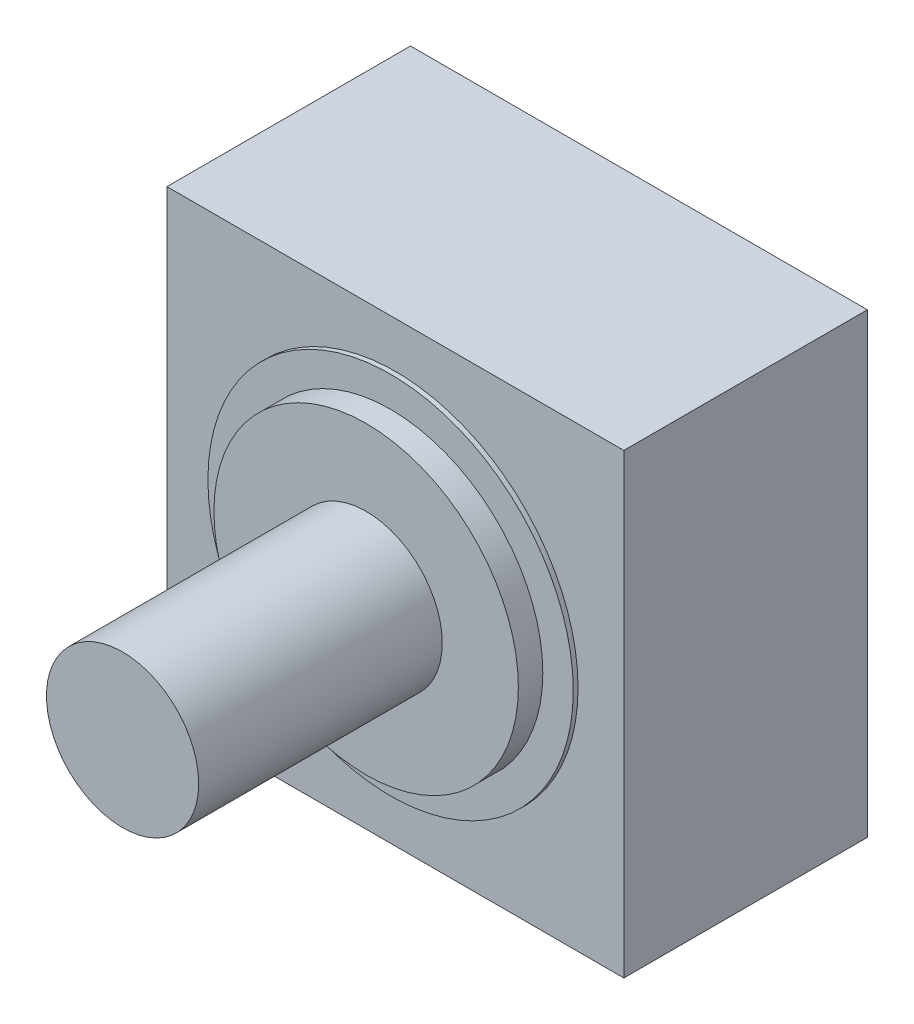
ISO-10303-21;
HEADER;
FILE_DESCRIPTION(('STEP AP214'),'2;1');
FILE_NAME('part.step','',(''),(''),'','','');
FILE_SCHEMA(('AUTOMOTIVE_DESIGN { 1 0 10303 214 1 1 1 1 }'));
ENDSEC;
DATA;
#1=APPLICATION_CONTEXT('core data for automotive mechanical design processes');
#2=APPLICATION_PROTOCOL_DEFINITION('international standard','automotive_design',2000,#1);
#3=PRODUCT_CONTEXT('',#1,'mechanical');
#4=PRODUCT('Part','Part','',(#3));
#5=PRODUCT_RELATED_PRODUCT_CATEGORY('part','',(#4));
#6=PRODUCT_DEFINITION_FORMATION('','',#4);
#7=PRODUCT_DEFINITION_CONTEXT('part definition',#1,'design');
#8=PRODUCT_DEFINITION('design','',#6,#7);
#9=PRODUCT_DEFINITION_SHAPE('','',#8);
#10=(LENGTH_UNIT() NAMED_UNIT(*) SI_UNIT(.MILLI.,.METRE.));
#11=(NAMED_UNIT(*) PLANE_ANGLE_UNIT() SI_UNIT($,.RADIAN.));
#12=(NAMED_UNIT(*) SI_UNIT($,.STERADIAN.) SOLID_ANGLE_UNIT());
#13=UNCERTAINTY_MEASURE_WITH_UNIT(LENGTH_MEASURE(1.E-05),#10,'distance_accuracy_value','');
#14=(GEOMETRIC_REPRESENTATION_CONTEXT(3) GLOBAL_UNCERTAINTY_ASSIGNED_CONTEXT((#13)) GLOBAL_UNIT_ASSIGNED_CONTEXT((#10,
#11,#12)) REPRESENTATION_CONTEXT('',''));
#15=CARTESIAN_POINT('',(0.,0.,0.));
#16=DIRECTION('',(0.,0.,1.));
#17=DIRECTION('',(1.,0.,0.));
#18=AXIS2_PLACEMENT_3D('',#15,#16,#17);
#19=CARTESIAN_POINT('',(0.,0.,5.08));
#20=DIRECTION('',(1.,0.,0.));
#21=DIRECTION('',(0.,0.,-1.));
#22=AXIS2_PLACEMENT_3D('',#19,#20,#21);
#23=PLANE('',#22);
#24=DIRECTION('',(0.,-1.,0.));
#25=VECTOR('',#24,1.);
#26=CARTESIAN_POINT('',(0.,0.,0.));
#27=LINE('',#26,#25);
#28=CARTESIAN_POINT('',(0.,9.53,0.));
#29=VERTEX_POINT('',#28);
#30=CARTESIAN_POINT('',(0.,0.,0.));
#31=VERTEX_POINT('',#30);
#32=EDGE_CURVE('E101',#29,#31,#27,.T.);
#33=ORIENTED_EDGE('',*,*,#32,.T.);
#34=DIRECTION('',(0.,0.,-1.));
#35=VECTOR('',#34,1.);
#36=CARTESIAN_POINT('',(0.,0.,5.08));
#37=LINE('',#36,#35);
#38=CARTESIAN_POINT('',(0.,0.,5.08));
#39=VERTEX_POINT('',#38);
#40=EDGE_CURVE('E43',#39,#31,#37,.T.);
#41=ORIENTED_EDGE('',*,*,#40,.F.);
#42=DIRECTION('',(0.,-1.,0.));
#43=VECTOR('',#42,1.);
#44=CARTESIAN_POINT('',(0.,0.,5.08));
#45=LINE('',#44,#43);
#46=CARTESIAN_POINT('',(0.,9.53,5.08));
#47=VERTEX_POINT('',#46);
#48=EDGE_CURVE('E87',#47,#39,#45,.T.);
#49=ORIENTED_EDGE('',*,*,#48,.F.);
#50=DIRECTION('',(0.,0.,-1.));
#51=VECTOR('',#50,1.);
#52=CARTESIAN_POINT('',(0.,9.53,5.08));
#53=LINE('',#52,#51);
#54=EDGE_CURVE('E97',#47,#29,#53,.T.);
#55=ORIENTED_EDGE('',*,*,#54,.T.);
#56=EDGE_LOOP('',(#33,#41,#49,#55));
#57=FACE_BOUND('',#56,.T.);
#58=ADVANCED_FACE('F35',(#57),#23,.F.);
#59=CARTESIAN_POINT('',(0.,0.,5.08));
#60=DIRECTION('',(0.,1.,0.));
#61=DIRECTION('',(0.,0.,1.));
#62=AXIS2_PLACEMENT_3D('',#59,#60,#61);
#63=PLANE('',#62);
#64=DIRECTION('',(1.,0.,0.));
#65=VECTOR('',#64,1.);
#66=CARTESIAN_POINT('',(0.,0.,0.));
#67=LINE('',#66,#65);
#68=CARTESIAN_POINT('',(9.53,0.,0.));
#69=VERTEX_POINT('',#68);
#70=EDGE_CURVE('E92',#31,#69,#67,.T.);
#71=ORIENTED_EDGE('',*,*,#70,.T.);
#72=DIRECTION('',(0.,0.,-1.));
#73=VECTOR('',#72,1.);
#74=CARTESIAN_POINT('',(9.53,0.,5.08));
#75=LINE('',#74,#73);
#76=CARTESIAN_POINT('',(9.53,0.,5.08));
#77=VERTEX_POINT('',#76);
#78=EDGE_CURVE('E90',#77,#69,#75,.T.);
#79=ORIENTED_EDGE('',*,*,#78,.F.);
#80=DIRECTION('',(1.,0.,0.));
#81=VECTOR('',#80,1.);
#82=CARTESIAN_POINT('',(0.,0.,5.08));
#83=LINE('',#82,#81);
#84=EDGE_CURVE('E82',#39,#77,#83,.T.);
#85=ORIENTED_EDGE('',*,*,#84,.F.);
#86=ORIENTED_EDGE('',*,*,#40,.T.);
#87=EDGE_LOOP('',(#71,#79,#85,#86));
#88=FACE_BOUND('',#87,.T.);
#89=ADVANCED_FACE('F91',(#88),#63,.F.);
#90=CARTESIAN_POINT('',(9.53,0.,5.08));
#91=DIRECTION('',(-1.,0.,0.));
#92=DIRECTION('',(0.,0.,1.));
#93=AXIS2_PLACEMENT_3D('',#90,#91,#92);
#94=PLANE('',#93);
#95=DIRECTION('',(0.,1.,0.));
#96=VECTOR('',#95,1.);
#97=CARTESIAN_POINT('',(9.53,0.,0.));
#98=LINE('',#97,#96);
#99=CARTESIAN_POINT('',(9.53,9.53,0.));
#100=VERTEX_POINT('',#99);
#101=EDGE_CURVE('E68',#69,#100,#98,.T.);
#102=ORIENTED_EDGE('',*,*,#101,.T.);
#103=DIRECTION('',(0.,0.,-1.));
#104=VECTOR('',#103,1.);
#105=CARTESIAN_POINT('',(9.53,9.53,5.08));
#106=LINE('',#105,#104);
#107=CARTESIAN_POINT('',(9.53,9.53,5.08));
#108=VERTEX_POINT('',#107);
#109=EDGE_CURVE('E93',#108,#100,#106,.T.);
#110=ORIENTED_EDGE('',*,*,#109,.F.);
#111=DIRECTION('',(0.,1.,0.));
#112=VECTOR('',#111,1.);
#113=CARTESIAN_POINT('',(9.53,0.,5.08));
#114=LINE('',#113,#112);
#115=EDGE_CURVE('E85',#77,#108,#114,.T.);
#116=ORIENTED_EDGE('',*,*,#115,.F.);
#117=ORIENTED_EDGE('',*,*,#78,.T.);
#118=EDGE_LOOP('',(#102,#110,#116,#117));
#119=FACE_BOUND('',#118,.T.);
#120=ADVANCED_FACE('F95',(#119),#94,.F.);
#121=CARTESIAN_POINT('',(0.,9.53,5.08));
#122=DIRECTION('',(0.,-1.,0.));
#123=DIRECTION('',(0.,0.,-1.));
#124=AXIS2_PLACEMENT_3D('',#121,#122,#123);
#125=PLANE('',#124);
#126=DIRECTION('',(-1.,0.,0.));
#127=VECTOR('',#126,1.);
#128=CARTESIAN_POINT('',(0.,9.53,0.));
#129=LINE('',#128,#127);
#130=EDGE_CURVE('E74',#100,#29,#129,.T.);
#131=ORIENTED_EDGE('',*,*,#130,.T.);
#132=ORIENTED_EDGE('',*,*,#54,.F.);
#133=DIRECTION('',(-1.,0.,0.));
#134=VECTOR('',#133,1.);
#135=CARTESIAN_POINT('',(0.,9.53,5.08));
#136=LINE('',#135,#134);
#137=EDGE_CURVE('E51',#108,#47,#136,.T.);
#138=ORIENTED_EDGE('',*,*,#137,.F.);
#139=ORIENTED_EDGE('',*,*,#109,.T.);
#140=EDGE_LOOP('',(#131,#132,#138,#139));
#141=FACE_BOUND('',#140,.T.);
#142=ADVANCED_FACE('F123',(#141),#125,.F.);
#143=CARTESIAN_POINT('',(0.,0.,5.08));
#144=DIRECTION('',(0.,0.,-1.));
#145=DIRECTION('',(-1.,0.,0.));
#146=AXIS2_PLACEMENT_3D('',#143,#144,#145);
#147=PLANE('',#146);
#148=CARTESIAN_POINT('',(4.765,4.765,5.08));
#149=DIRECTION('',(0.,0.,-1.));
#150=DIRECTION('',(-1.,0.,0.));
#151=AXIS2_PLACEMENT_3D('',#148,#149,#150);
#152=CIRCLE('',#151,3.81);
#153=CARTESIAN_POINT('',(0.955000000000002,4.765,5.08));
#154=VERTEX_POINT('',#153);
#155=EDGE_CURVE('E11',#154,#154,#152,.F.);
#156=ORIENTED_EDGE('',*,*,#155,.F.);
#157=EDGE_LOOP('',(#156));
#158=FACE_BOUND('',#157,.T.);
#159=ORIENTED_EDGE('',*,*,#48,.T.);
#160=ORIENTED_EDGE('',*,*,#84,.T.);
#161=ORIENTED_EDGE('',*,*,#115,.T.);
#162=ORIENTED_EDGE('',*,*,#137,.T.);
#163=EDGE_LOOP('',(#159,#160,#161,#162));
#164=FACE_BOUND('',#163,.T.);
#165=ADVANCED_FACE('F83',(#158,#164),#147,.F.);
#166=CARTESIAN_POINT('',(0.,0.,0.));
#167=DIRECTION('',(0.,0.,-1.));
#168=DIRECTION('',(-1.,0.,0.));
#169=AXIS2_PLACEMENT_3D('',#166,#167,#168);
#170=PLANE('',#169);
#171=ORIENTED_EDGE('',*,*,#32,.F.);
#172=ORIENTED_EDGE('',*,*,#130,.F.);
#173=ORIENTED_EDGE('',*,*,#101,.F.);
#174=ORIENTED_EDGE('',*,*,#70,.F.);
#175=EDGE_LOOP('',(#171,#172,#173,#174));
#176=FACE_BOUND('',#175,.T.);
#177=ADVANCED_FACE('F112',(#176),#170,.T.);
#178=CARTESIAN_POINT('',(4.765,4.765,5.18));
#179=DIRECTION('',(0.,0.,-1.));
#180=DIRECTION('',(-1.,0.,0.));
#181=AXIS2_PLACEMENT_3D('',#178,#179,#180);
#182=CYLINDRICAL_SURFACE('',#181,3.81);
#183=CARTESIAN_POINT('',(4.765,4.765,5.18));
#184=DIRECTION('',(0.,0.,1.));
#185=DIRECTION('',(1.,0.,0.));
#186=AXIS2_PLACEMENT_3D('',#183,#184,#185);
#187=CIRCLE('',#186,3.81);
#188=CARTESIAN_POINT('',(8.575,4.765,5.18));
#189=VERTEX_POINT('',#188);
#190=EDGE_CURVE('E104',#189,#189,#187,.T.);
#191=ORIENTED_EDGE('',*,*,#190,.F.);
#192=EDGE_LOOP('',(#191));
#193=FACE_BOUND('',#192,.T.);
#194=ORIENTED_EDGE('',*,*,#155,.T.);
#195=EDGE_LOOP('',(#194));
#196=FACE_BOUND('',#195,.T.);
#197=ADVANCED_FACE('F114',(#193,#196),#182,.T.);
#198=CARTESIAN_POINT('',(4.765,4.765,5.18));
#199=DIRECTION('',(0.,0.,1.));
#200=DIRECTION('',(1.,0.,0.));
#201=AXIS2_PLACEMENT_3D('',#198,#199,#200);
#202=PLANE('',#201);
#203=CARTESIAN_POINT('',(4.765,4.765,5.18));
#204=DIRECTION('',(0.,0.,1.));
#205=DIRECTION('',(1.,0.,0.));
#206=AXIS2_PLACEMENT_3D('',#203,#204,#205);
#207=CIRCLE('',#206,3.175);
#208=CARTESIAN_POINT('',(7.94,4.765,5.18));
#209=VERTEX_POINT('',#208);
#210=EDGE_CURVE('E212',#209,#209,#207,.T.);
#211=ORIENTED_EDGE('',*,*,#210,.F.);
#212=EDGE_LOOP('',(#211));
#213=FACE_BOUND('',#212,.T.);
#214=ORIENTED_EDGE('',*,*,#190,.T.);
#215=EDGE_LOOP('',(#214));
#216=FACE_BOUND('',#215,.T.);
#217=ADVANCED_FACE('F120',(#213,#216),#202,.T.);
#218=CARTESIAN_POINT('',(4.765,4.765,5.69));
#219=DIRECTION('',(0.,0.,-1.));
#220=DIRECTION('',(-1.,0.,0.));
#221=AXIS2_PLACEMENT_3D('',#218,#219,#220);
#222=CYLINDRICAL_SURFACE('',#221,3.175);
#223=CARTESIAN_POINT('',(4.765,4.765,5.69));
#224=DIRECTION('',(0.,0.,1.));
#225=DIRECTION('',(1.,0.,0.));
#226=AXIS2_PLACEMENT_3D('',#223,#224,#225);
#227=CIRCLE('',#226,3.175);
#228=CARTESIAN_POINT('',(7.94,4.765,5.69));
#229=VERTEX_POINT('',#228);
#230=EDGE_CURVE('E216',#229,#229,#227,.T.);
#231=ORIENTED_EDGE('',*,*,#230,.F.);
#232=EDGE_LOOP('',(#231));
#233=FACE_BOUND('',#232,.T.);
#234=ORIENTED_EDGE('',*,*,#210,.T.);
#235=EDGE_LOOP('',(#234));
#236=FACE_BOUND('',#235,.T.);
#237=ADVANCED_FACE('F161',(#233,#236),#222,.T.);
#238=CARTESIAN_POINT('',(4.765,4.765,5.69));
#239=DIRECTION('',(0.,0.,1.));
#240=DIRECTION('',(1.,0.,0.));
#241=AXIS2_PLACEMENT_3D('',#238,#239,#240);
#242=PLANE('',#241);
#243=CARTESIAN_POINT('',(4.765,4.765,5.69));
#244=DIRECTION('',(0.,0.,1.));
#245=DIRECTION('',(1.,0.,0.));
#246=AXIS2_PLACEMENT_3D('',#243,#244,#245);
#247=CIRCLE('',#246,1.5875);
#248=CARTESIAN_POINT('',(6.3525,4.765,5.69));
#249=VERTEX_POINT('',#248);
#250=EDGE_CURVE('E213',#249,#249,#247,.T.);
#251=ORIENTED_EDGE('',*,*,#250,.F.);
#252=EDGE_LOOP('',(#251));
#253=FACE_BOUND('',#252,.T.);
#254=ORIENTED_EDGE('',*,*,#230,.T.);
#255=EDGE_LOOP('',(#254));
#256=FACE_BOUND('',#255,.T.);
#257=ADVANCED_FACE('F171',(#253,#256),#242,.T.);
#258=CARTESIAN_POINT('',(4.765,4.765,10.77));
#259=DIRECTION('',(0.,0.,-1.));
#260=DIRECTION('',(-1.,0.,0.));
#261=AXIS2_PLACEMENT_3D('',#258,#259,#260);
#262=CYLINDRICAL_SURFACE('',#261,1.5875);
#263=CARTESIAN_POINT('',(4.765,4.765,10.77));
#264=DIRECTION('',(0.,0.,1.));
#265=DIRECTION('',(1.,0.,0.));
#266=AXIS2_PLACEMENT_3D('',#263,#264,#265);
#267=CIRCLE('',#266,1.5875);
#268=CARTESIAN_POINT('',(6.3525,4.765,10.77));
#269=VERTEX_POINT('',#268);
#270=EDGE_CURVE('E211',#269,#269,#267,.T.);
#271=ORIENTED_EDGE('',*,*,#270,.F.);
#272=EDGE_LOOP('',(#271));
#273=FACE_BOUND('',#272,.T.);
#274=ORIENTED_EDGE('',*,*,#250,.T.);
#275=EDGE_LOOP('',(#274));
#276=FACE_BOUND('',#275,.T.);
#277=ADVANCED_FACE('F181',(#273,#276),#262,.T.);
#278=CARTESIAN_POINT('',(4.765,4.765,10.77));
#279=DIRECTION('',(0.,0.,1.));
#280=DIRECTION('',(1.,0.,0.));
#281=AXIS2_PLACEMENT_3D('',#278,#279,#280);
#282=PLANE('',#281);
#283=ORIENTED_EDGE('',*,*,#270,.T.);
#284=EDGE_LOOP('',(#283));
#285=FACE_BOUND('',#284,.T.);
#286=ADVANCED_FACE('F192',(#285),#282,.T.);
#287=CLOSED_SHELL('',(#58,#89,#120,#142,#165,#177,#197,#217,#237,#257,#277,#286));
#288=MANIFOLD_SOLID_BREP('B2',#287);
#289=ADVANCED_BREP_SHAPE_REPRESENTATION('',(#18,#288),#14);
#290=SHAPE_DEFINITION_REPRESENTATION(#9,#289);
ENDSEC;
END-ISO-10303-21;
